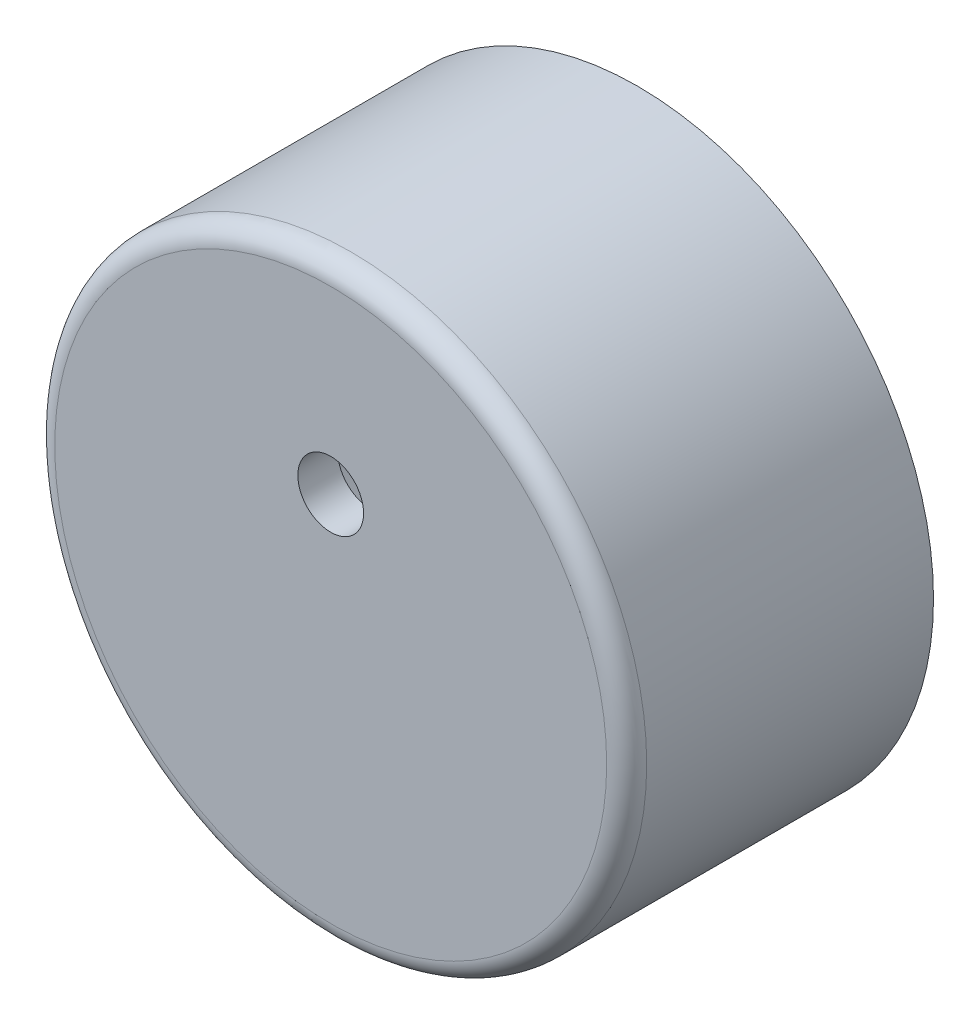
ISO-10303-21;
HEADER;
FILE_DESCRIPTION(('STEP AP214'),'2;1');
FILE_NAME('part.step','',(''),(''),'','','');
FILE_SCHEMA(('AUTOMOTIVE_DESIGN { 1 0 10303 214 1 1 1 1 }'));
ENDSEC;
DATA;
#1=APPLICATION_CONTEXT('core data for automotive mechanical design processes');
#2=APPLICATION_PROTOCOL_DEFINITION('international standard','automotive_design',2000,#1);
#3=PRODUCT_CONTEXT('',#1,'mechanical');
#4=PRODUCT('Part','Part','',(#3));
#5=PRODUCT_RELATED_PRODUCT_CATEGORY('part','',(#4));
#6=PRODUCT_DEFINITION_FORMATION('','',#4);
#7=PRODUCT_DEFINITION_CONTEXT('part definition',#1,'design');
#8=PRODUCT_DEFINITION('design','',#6,#7);
#9=PRODUCT_DEFINITION_SHAPE('','',#8);
#10=(LENGTH_UNIT() NAMED_UNIT(*) SI_UNIT(.MILLI.,.METRE.));
#11=(NAMED_UNIT(*) PLANE_ANGLE_UNIT() SI_UNIT($,.RADIAN.));
#12=(NAMED_UNIT(*) SI_UNIT($,.STERADIAN.) SOLID_ANGLE_UNIT());
#13=UNCERTAINTY_MEASURE_WITH_UNIT(LENGTH_MEASURE(1.E-05),#10,'distance_accuracy_value','');
#14=(GEOMETRIC_REPRESENTATION_CONTEXT(3) GLOBAL_UNCERTAINTY_ASSIGNED_CONTEXT((#13)) GLOBAL_UNIT_ASSIGNED_CONTEXT((#10,
#11,#12)) REPRESENTATION_CONTEXT('',''));
#15=CARTESIAN_POINT('',(0.,0.,0.));
#16=DIRECTION('',(0.,0.,1.));
#17=DIRECTION('',(1.,0.,0.));
#18=AXIS2_PLACEMENT_3D('',#15,#16,#17);
#19=CARTESIAN_POINT('',(177.565086814611,-76.6061730373818,0.));
#20=DIRECTION('',(0.,0.,1.));
#21=DIRECTION('',(1.,0.,0.));
#22=AXIS2_PLACEMENT_3D('',#19,#20,#21);
#23=PLANE('',#22);
#24=CARTESIAN_POINT('',(177.565086814611,-76.6061730373818,0.));
#25=DIRECTION('',(0.,0.,1.));
#26=DIRECTION('',(1.,0.,0.));
#27=AXIS2_PLACEMENT_3D('',#24,#25,#26);
#28=CIRCLE('',#27,44.375);
#29=CARTESIAN_POINT('',(221.940086814611,-76.6061730373818,0.));
#30=VERTEX_POINT('',#29);
#31=EDGE_CURVE('E80',#30,#30,#28,.T.);
#32=ORIENTED_EDGE('',*,*,#31,.F.);
#33=EDGE_LOOP('',(#32));
#34=FACE_BOUND('',#33,.T.);
#35=CARTESIAN_POINT('',(177.565086814611,-76.6061730373818,0.));
#36=DIRECTION('',(0.,0.,1.));
#37=DIRECTION('',(1.,0.,0.));
#38=AXIS2_PLACEMENT_3D('',#35,#36,#37);
#39=CIRCLE('',#38,41.375);
#40=CARTESIAN_POINT('',(218.940086814611,-76.6061730373818,0.));
#41=VERTEX_POINT('',#40);
#42=EDGE_CURVE('E83',#41,#41,#39,.T.);
#43=ORIENTED_EDGE('',*,*,#42,.T.);
#44=EDGE_LOOP('',(#43));
#45=FACE_BOUND('',#44,.T.);
#46=ADVANCED_FACE('F60',(#34,#45),#23,.F.);
#47=CARTESIAN_POINT('',(177.565086814611,-76.6061730373818,40.));
#48=DIRECTION('',(0.,0.,-1.));
#49=DIRECTION('',(-1.,0.,0.));
#50=AXIS2_PLACEMENT_3D('',#47,#48,#49);
#51=CYLINDRICAL_SURFACE('',#50,44.375);
#52=CARTESIAN_POINT('',(177.565086814611,-76.6061730373818,43.));
#53=DIRECTION('',(0.,0.,1.));
#54=DIRECTION('',(1.,0.,0.));
#55=AXIS2_PLACEMENT_3D('',#52,#53,#54);
#56=CIRCLE('',#55,44.375);
#57=CARTESIAN_POINT('',(221.940086814611,-76.6061730373818,43.));
#58=VERTEX_POINT('',#57);
#59=EDGE_CURVE('E11',#58,#58,#56,.F.);
#60=ORIENTED_EDGE('',*,*,#59,.T.);
#61=EDGE_LOOP('',(#60));
#62=FACE_BOUND('',#61,.T.);
#63=ORIENTED_EDGE('',*,*,#31,.T.);
#64=EDGE_LOOP('',(#63));
#65=FACE_BOUND('',#64,.T.);
#66=ADVANCED_FACE('F111',(#62,#65),#51,.T.);
#67=CARTESIAN_POINT('',(177.565086814611,-76.6061730373818,40.));
#68=DIRECTION('',(0.,0.,-1.));
#69=DIRECTION('',(-1.,0.,0.));
#70=AXIS2_PLACEMENT_3D('',#67,#68,#69);
#71=CYLINDRICAL_SURFACE('',#70,41.375);
#72=CARTESIAN_POINT('',(177.565086814611,-76.6061730373818,33.));
#73=DIRECTION('',(0.,0.,1.));
#74=DIRECTION('',(1.,0.,0.));
#75=AXIS2_PLACEMENT_3D('',#72,#73,#74);
#76=CIRCLE('',#75,41.375);
#77=CARTESIAN_POINT('',(218.940086814611,-76.6061730373818,33.));
#78=VERTEX_POINT('',#77);
#79=EDGE_CURVE('E75',#78,#78,#76,.T.);
#80=ORIENTED_EDGE('',*,*,#79,.T.);
#81=EDGE_LOOP('',(#80));
#82=FACE_BOUND('',#81,.T.);
#83=ORIENTED_EDGE('',*,*,#42,.F.);
#84=EDGE_LOOP('',(#83));
#85=FACE_BOUND('',#84,.T.);
#86=ADVANCED_FACE('F106',(#82,#85),#71,.F.);
#87=CARTESIAN_POINT('',(177.565086814611,-76.6061730373818,40.));
#88=DIRECTION('',(0.,0.,1.));
#89=DIRECTION('',(1.,0.,0.));
#90=AXIS2_PLACEMENT_3D('',#87,#88,#89);
#91=PLANE('',#90);
#92=CARTESIAN_POINT('',(177.565086814611,-62.2311730373818,40.));
#93=DIRECTION('',(0.,0.,1.));
#94=DIRECTION('',(1.,0.,0.));
#95=AXIS2_PLACEMENT_3D('',#92,#93,#94);
#96=CIRCLE('',#95,4.93);
#97=CARTESIAN_POINT('',(182.495086814611,-62.2311730373818,40.));
#98=VERTEX_POINT('',#97);
#99=EDGE_CURVE('E86',#98,#98,#96,.F.);
#100=ORIENTED_EDGE('',*,*,#99,.F.);
#101=EDGE_LOOP('',(#100));
#102=FACE_BOUND('',#101,.T.);
#103=CARTESIAN_POINT('',(177.565086814611,-76.6061730373818,40.));
#104=DIRECTION('',(0.,0.,1.));
#105=DIRECTION('',(1.,0.,0.));
#106=AXIS2_PLACEMENT_3D('',#103,#104,#105);
#107=CIRCLE('',#106,34.375);
#108=CARTESIAN_POINT('',(211.940086814611,-76.6061730373818,40.));
#109=VERTEX_POINT('',#108);
#110=EDGE_CURVE('E71',#109,#109,#107,.F.);
#111=ORIENTED_EDGE('',*,*,#110,.T.);
#112=EDGE_LOOP('',(#111));
#113=FACE_BOUND('',#112,.T.);
#114=ADVANCED_FACE('F99',(#102,#113),#91,.F.);
#115=CARTESIAN_POINT('',(177.565086814611,-76.6061730373818,46.));
#116=DIRECTION('',(0.,0.,1.));
#117=DIRECTION('',(1.,0.,0.));
#118=AXIS2_PLACEMENT_3D('',#115,#116,#117);
#119=PLANE('',#118);
#120=CARTESIAN_POINT('',(177.565086814611,-62.2311730373818,46.));
#121=DIRECTION('',(0.,0.,1.));
#122=DIRECTION('',(1.,0.,0.));
#123=AXIS2_PLACEMENT_3D('',#120,#121,#122);
#124=CIRCLE('',#123,4.93);
#125=CARTESIAN_POINT('',(182.495086814611,-62.2311730373818,46.));
#126=VERTEX_POINT('',#125);
#127=EDGE_CURVE('E89',#126,#126,#124,.T.);
#128=ORIENTED_EDGE('',*,*,#127,.F.);
#129=EDGE_LOOP('',(#128));
#130=FACE_BOUND('',#129,.T.);
#131=CARTESIAN_POINT('',(177.565086814611,-76.6061730373818,46.));
#132=DIRECTION('',(0.,0.,1.));
#133=DIRECTION('',(1.,0.,0.));
#134=AXIS2_PLACEMENT_3D('',#131,#132,#133);
#135=CIRCLE('',#134,41.375);
#136=CARTESIAN_POINT('',(218.940086814611,-76.6061730373818,46.));
#137=VERTEX_POINT('',#136);
#138=EDGE_CURVE('E67',#137,#137,#135,.T.);
#139=ORIENTED_EDGE('',*,*,#138,.T.);
#140=EDGE_LOOP('',(#139));
#141=FACE_BOUND('',#140,.T.);
#142=ADVANCED_FACE('F96',(#130,#141),#119,.T.);
#143=CARTESIAN_POINT('',(177.565086814611,-76.6061730373818,33.));
#144=DIRECTION('',(0.,0.,1.));
#145=DIRECTION('',(1.,0.,0.));
#146=AXIS2_PLACEMENT_3D('',#143,#144,#145);
#147=TOROIDAL_SURFACE('',#146,34.375,7.);
#148=ORIENTED_EDGE('',*,*,#110,.F.);
#149=EDGE_LOOP('',(#148));
#150=FACE_BOUND('',#149,.T.);
#151=ORIENTED_EDGE('',*,*,#79,.F.);
#152=EDGE_LOOP('',(#151));
#153=FACE_BOUND('',#152,.T.);
#154=ADVANCED_FACE('F98',(#150,#153),#147,.F.);
#155=CARTESIAN_POINT('',(177.565086814611,-76.6061730373818,43.));
#156=DIRECTION('',(0.,0.,1.));
#157=DIRECTION('',(1.,0.,0.));
#158=AXIS2_PLACEMENT_3D('',#155,#156,#157);
#159=TOROIDAL_SURFACE('',#158,41.375,3.);
#160=ORIENTED_EDGE('',*,*,#59,.F.);
#161=EDGE_LOOP('',(#160));
#162=FACE_BOUND('',#161,.T.);
#163=ORIENTED_EDGE('',*,*,#138,.F.);
#164=EDGE_LOOP('',(#163));
#165=FACE_BOUND('',#164,.T.);
#166=ADVANCED_FACE('F62',(#162,#165),#159,.T.);
#167=CARTESIAN_POINT('',(177.565086814611,-62.2311730373818,-0.001000000000001));
#168=DIRECTION('',(0.,0.,1.));
#169=DIRECTION('',(1.,0.,0.));
#170=AXIS2_PLACEMENT_3D('',#167,#168,#169);
#171=CYLINDRICAL_SURFACE('',#170,4.93);
#172=ORIENTED_EDGE('',*,*,#127,.T.);
#173=EDGE_LOOP('',(#172));
#174=FACE_BOUND('',#173,.T.);
#175=ORIENTED_EDGE('',*,*,#99,.T.);
#176=EDGE_LOOP('',(#175));
#177=FACE_BOUND('',#176,.T.);
#178=ADVANCED_FACE('F93',(#174,#177),#171,.F.);
#179=CLOSED_SHELL('',(#46,#66,#86,#114,#142,#154,#166,#178));
#180=MANIFOLD_SOLID_BREP('B2',#179);
#181=ADVANCED_BREP_SHAPE_REPRESENTATION('',(#18,#180),#14);
#182=SHAPE_DEFINITION_REPRESENTATION(#9,#181);
ENDSEC;
END-ISO-10303-21;
